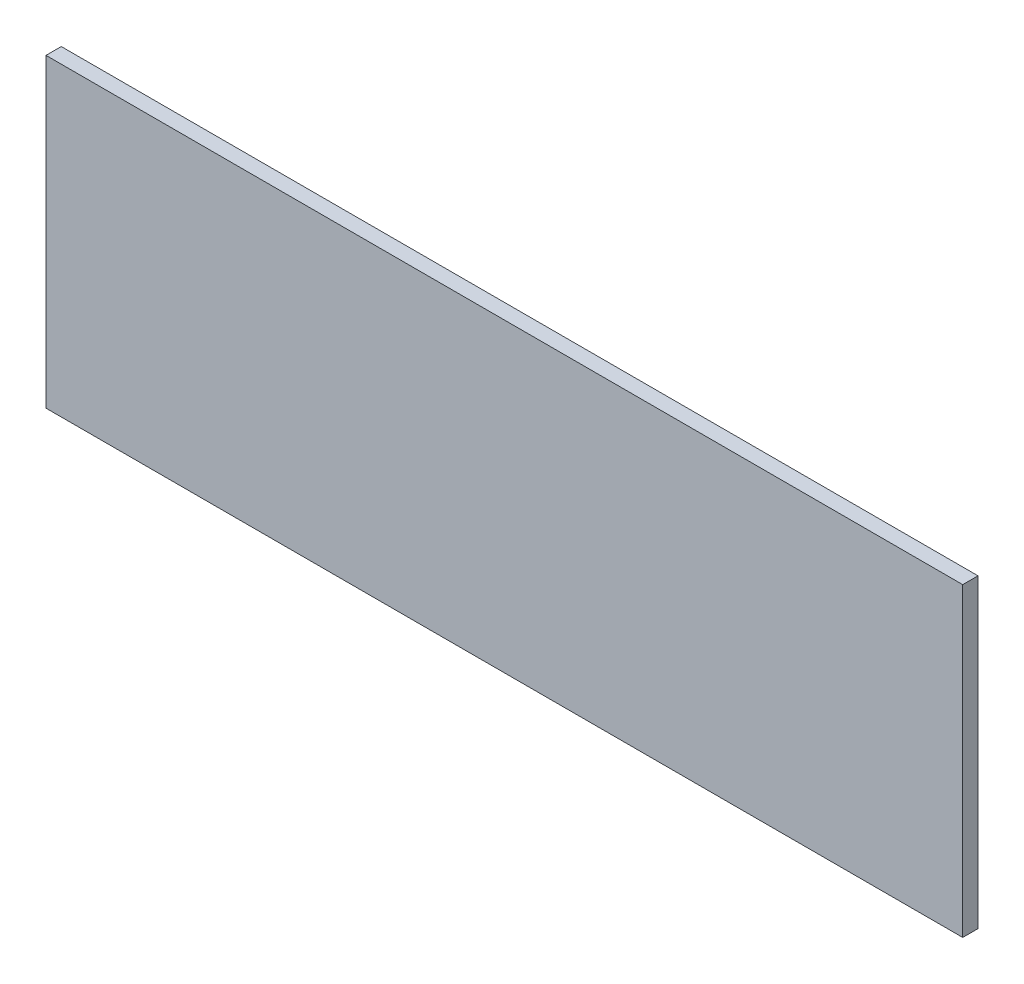
ISO-10303-21;
HEADER;
FILE_DESCRIPTION(('STEP AP214'),'2;1');
FILE_NAME('part.step','',(''),(''),'','','');
FILE_SCHEMA(('AUTOMOTIVE_DESIGN { 1 0 10303 214 1 1 1 1 }'));
ENDSEC;
DATA;
#1=APPLICATION_CONTEXT('core data for automotive mechanical design processes');
#2=APPLICATION_PROTOCOL_DEFINITION('international standard','automotive_design',2000,#1);
#3=PRODUCT_CONTEXT('',#1,'mechanical');
#4=PRODUCT('Part','Part','',(#3));
#5=PRODUCT_RELATED_PRODUCT_CATEGORY('part','',(#4));
#6=PRODUCT_DEFINITION_FORMATION('','',#4);
#7=PRODUCT_DEFINITION_CONTEXT('part definition',#1,'design');
#8=PRODUCT_DEFINITION('design','',#6,#7);
#9=PRODUCT_DEFINITION_SHAPE('','',#8);
#10=(LENGTH_UNIT() NAMED_UNIT(*) SI_UNIT(.MILLI.,.METRE.));
#11=(NAMED_UNIT(*) PLANE_ANGLE_UNIT() SI_UNIT($,.RADIAN.));
#12=(NAMED_UNIT(*) SI_UNIT($,.STERADIAN.) SOLID_ANGLE_UNIT());
#13=UNCERTAINTY_MEASURE_WITH_UNIT(LENGTH_MEASURE(1.E-05),#10,'distance_accuracy_value','');
#14=(GEOMETRIC_REPRESENTATION_CONTEXT(3) GLOBAL_UNCERTAINTY_ASSIGNED_CONTEXT((#13)) GLOBAL_UNIT_ASSIGNED_CONTEXT((#10,
#11,#12)) REPRESENTATION_CONTEXT('',''));
#15=CARTESIAN_POINT('',(0.,0.,0.));
#16=DIRECTION('',(0.,0.,1.));
#17=DIRECTION('',(1.,0.,0.));
#18=AXIS2_PLACEMENT_3D('',#15,#16,#17);
#19=CARTESIAN_POINT('',(6000.,2000.,200.));
#20=DIRECTION('',(-1.,0.,0.));
#21=DIRECTION('',(0.,0.,1.));
#22=AXIS2_PLACEMENT_3D('',#19,#20,#21);
#23=PLANE('',#22);
#24=DIRECTION('',(0.,1.,0.));
#25=VECTOR('',#24,1.);
#26=CARTESIAN_POINT('',(6000.,2000.,0.));
#27=LINE('',#26,#25);
#28=CARTESIAN_POINT('',(6000.,-2000.,0.));
#29=VERTEX_POINT('',#28);
#30=CARTESIAN_POINT('',(6000.,2000.,0.));
#31=VERTEX_POINT('',#30);
#32=EDGE_CURVE('E111',#29,#31,#27,.T.);
#33=ORIENTED_EDGE('',*,*,#32,.T.);
#34=DIRECTION('',(0.,0.,-1.));
#35=VECTOR('',#34,1.);
#36=CARTESIAN_POINT('',(6000.,2000.,200.));
#37=LINE('',#36,#35);
#38=CARTESIAN_POINT('',(6000.,2000.,200.));
#39=VERTEX_POINT('',#38);
#40=EDGE_CURVE('E11',#39,#31,#37,.T.);
#41=ORIENTED_EDGE('',*,*,#40,.F.);
#42=DIRECTION('',(0.,1.,0.));
#43=VECTOR('',#42,1.);
#44=CARTESIAN_POINT('',(6000.,2000.,200.));
#45=LINE('',#44,#43);
#46=CARTESIAN_POINT('',(6000.,-2000.,200.));
#47=VERTEX_POINT('',#46);
#48=EDGE_CURVE('E95',#47,#39,#45,.T.);
#49=ORIENTED_EDGE('',*,*,#48,.F.);
#50=DIRECTION('',(0.,0.,-1.));
#51=VECTOR('',#50,1.);
#52=CARTESIAN_POINT('',(6000.,-2000.,200.));
#53=LINE('',#52,#51);
#54=EDGE_CURVE('E107',#47,#29,#53,.T.);
#55=ORIENTED_EDGE('',*,*,#54,.T.);
#56=EDGE_LOOP('',(#33,#41,#49,#55));
#57=FACE_BOUND('',#56,.T.);
#58=ADVANCED_FACE('F43',(#57),#23,.F.);
#59=CARTESIAN_POINT('',(-6000.,2000.,200.));
#60=DIRECTION('',(0.,-1.,0.));
#61=DIRECTION('',(0.,0.,-1.));
#62=AXIS2_PLACEMENT_3D('',#59,#60,#61);
#63=PLANE('',#62);
#64=DIRECTION('',(-1.,0.,0.));
#65=VECTOR('',#64,1.);
#66=CARTESIAN_POINT('',(-6000.,2000.,0.));
#67=LINE('',#66,#65);
#68=CARTESIAN_POINT('',(-6000.,2000.,0.));
#69=VERTEX_POINT('',#68);
#70=EDGE_CURVE('E100',#31,#69,#67,.T.);
#71=ORIENTED_EDGE('',*,*,#70,.T.);
#72=DIRECTION('',(0.,0.,-1.));
#73=VECTOR('',#72,1.);
#74=CARTESIAN_POINT('',(-6000.,2000.,200.));
#75=LINE('',#74,#73);
#76=CARTESIAN_POINT('',(-6000.,2000.,200.));
#77=VERTEX_POINT('',#76);
#78=EDGE_CURVE('E52',#77,#69,#75,.T.);
#79=ORIENTED_EDGE('',*,*,#78,.F.);
#80=DIRECTION('',(-1.,0.,0.));
#81=VECTOR('',#80,1.);
#82=CARTESIAN_POINT('',(-6000.,2000.,200.));
#83=LINE('',#82,#81);
#84=EDGE_CURVE('E90',#39,#77,#83,.T.);
#85=ORIENTED_EDGE('',*,*,#84,.F.);
#86=ORIENTED_EDGE('',*,*,#40,.T.);
#87=EDGE_LOOP('',(#71,#79,#85,#86));
#88=FACE_BOUND('',#87,.T.);
#89=ADVANCED_FACE('F99',(#88),#63,.F.);
#90=CARTESIAN_POINT('',(-6000.,2000.,200.));
#91=DIRECTION('',(1.,0.,0.));
#92=DIRECTION('',(0.,0.,-1.));
#93=AXIS2_PLACEMENT_3D('',#90,#91,#92);
#94=PLANE('',#93);
#95=DIRECTION('',(0.,-1.,0.));
#96=VECTOR('',#95,1.);
#97=CARTESIAN_POINT('',(-6000.,2000.,0.));
#98=LINE('',#97,#96);
#99=CARTESIAN_POINT('',(-6000.,-2000.,0.));
#100=VERTEX_POINT('',#99);
#101=EDGE_CURVE('E77',#69,#100,#98,.T.);
#102=ORIENTED_EDGE('',*,*,#101,.T.);
#103=DIRECTION('',(0.,0.,-1.));
#104=VECTOR('',#103,1.);
#105=CARTESIAN_POINT('',(-6000.,-2000.,200.));
#106=LINE('',#105,#104);
#107=CARTESIAN_POINT('',(-6000.,-2000.,200.));
#108=VERTEX_POINT('',#107);
#109=EDGE_CURVE('E102',#108,#100,#106,.T.);
#110=ORIENTED_EDGE('',*,*,#109,.F.);
#111=DIRECTION('',(0.,-1.,0.));
#112=VECTOR('',#111,1.);
#113=CARTESIAN_POINT('',(-6000.,2000.,200.));
#114=LINE('',#113,#112);
#115=EDGE_CURVE('E93',#77,#108,#114,.T.);
#116=ORIENTED_EDGE('',*,*,#115,.F.);
#117=ORIENTED_EDGE('',*,*,#78,.T.);
#118=EDGE_LOOP('',(#102,#110,#116,#117));
#119=FACE_BOUND('',#118,.T.);
#120=ADVANCED_FACE('F103',(#119),#94,.F.);
#121=CARTESIAN_POINT('',(-6000.,-2000.,200.));
#122=DIRECTION('',(0.,1.,0.));
#123=DIRECTION('',(-1.,0.,0.));
#124=AXIS2_PLACEMENT_3D('',#121,#122,#123);
#125=PLANE('',#124);
#126=DIRECTION('',(1.,0.,0.));
#127=VECTOR('',#126,1.);
#128=CARTESIAN_POINT('',(-6000.,-2000.,0.));
#129=LINE('',#128,#127);
#130=EDGE_CURVE('E83',#100,#29,#129,.T.);
#131=ORIENTED_EDGE('',*,*,#130,.T.);
#132=ORIENTED_EDGE('',*,*,#54,.F.);
#133=DIRECTION('',(1.,0.,0.));
#134=VECTOR('',#133,1.);
#135=CARTESIAN_POINT('',(-6000.,-2000.,200.));
#136=LINE('',#135,#134);
#137=EDGE_CURVE('E60',#108,#47,#136,.T.);
#138=ORIENTED_EDGE('',*,*,#137,.F.);
#139=ORIENTED_EDGE('',*,*,#109,.T.);
#140=EDGE_LOOP('',(#131,#132,#138,#139));
#141=FACE_BOUND('',#140,.T.);
#142=ADVANCED_FACE('F124',(#141),#125,.F.);
#143=CARTESIAN_POINT('',(0.,0.,200.));
#144=DIRECTION('',(0.,0.,1.));
#145=DIRECTION('',(1.,0.,0.));
#146=AXIS2_PLACEMENT_3D('',#143,#144,#145);
#147=PLANE('',#146);
#148=ORIENTED_EDGE('',*,*,#48,.T.);
#149=ORIENTED_EDGE('',*,*,#84,.T.);
#150=ORIENTED_EDGE('',*,*,#115,.T.);
#151=ORIENTED_EDGE('',*,*,#137,.T.);
#152=EDGE_LOOP('',(#148,#149,#150,#151));
#153=FACE_BOUND('',#152,.T.);
#154=ADVANCED_FACE('F91',(#153),#147,.T.);
#155=CARTESIAN_POINT('',(0.,0.,0.));
#156=DIRECTION('',(0.,0.,1.));
#157=DIRECTION('',(1.,0.,0.));
#158=AXIS2_PLACEMENT_3D('',#155,#156,#157);
#159=PLANE('',#158);
#160=ORIENTED_EDGE('',*,*,#32,.F.);
#161=ORIENTED_EDGE('',*,*,#130,.F.);
#162=ORIENTED_EDGE('',*,*,#101,.F.);
#163=ORIENTED_EDGE('',*,*,#70,.F.);
#164=EDGE_LOOP('',(#160,#161,#162,#163));
#165=FACE_BOUND('',#164,.T.);
#166=ADVANCED_FACE('F127',(#165),#159,.F.);
#167=CLOSED_SHELL('',(#58,#89,#120,#142,#154,#166));
#168=MANIFOLD_SOLID_BREP('B2',#167);
#169=ADVANCED_BREP_SHAPE_REPRESENTATION('',(#18,#168),#14);
#170=SHAPE_DEFINITION_REPRESENTATION(#9,#169);
ENDSEC;
END-ISO-10303-21;
